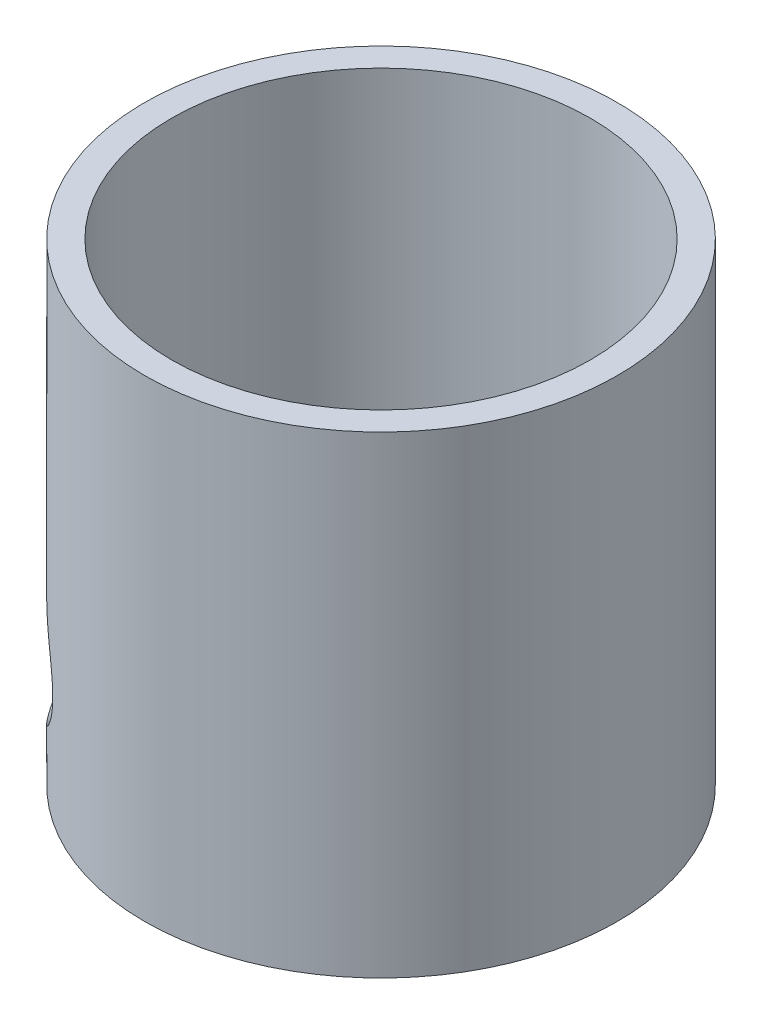
ISO-10303-21;
HEADER;
FILE_DESCRIPTION(('STEP AP214'),'2;1');
FILE_NAME('part.step','',(''),(''),'','','');
FILE_SCHEMA(('AUTOMOTIVE_DESIGN { 1 0 10303 214 1 1 1 1 }'));
ENDSEC;
DATA;
#1=APPLICATION_CONTEXT('core data for automotive mechanical design processes');
#2=APPLICATION_PROTOCOL_DEFINITION('international standard','automotive_design',2000,#1);
#3=PRODUCT_CONTEXT('',#1,'mechanical');
#4=PRODUCT('Part','Part','',(#3));
#5=PRODUCT_RELATED_PRODUCT_CATEGORY('part','',(#4));
#6=PRODUCT_DEFINITION_FORMATION('','',#4);
#7=PRODUCT_DEFINITION_CONTEXT('part definition',#1,'design');
#8=PRODUCT_DEFINITION('design','',#6,#7);
#9=PRODUCT_DEFINITION_SHAPE('','',#8);
#10=(LENGTH_UNIT() NAMED_UNIT(*) SI_UNIT(.MILLI.,.METRE.));
#11=(NAMED_UNIT(*) PLANE_ANGLE_UNIT() SI_UNIT($,.RADIAN.));
#12=(NAMED_UNIT(*) SI_UNIT($,.STERADIAN.) SOLID_ANGLE_UNIT());
#13=UNCERTAINTY_MEASURE_WITH_UNIT(LENGTH_MEASURE(1.E-05),#10,'distance_accuracy_value','');
#14=(GEOMETRIC_REPRESENTATION_CONTEXT(3) GLOBAL_UNCERTAINTY_ASSIGNED_CONTEXT((#13)) GLOBAL_UNIT_ASSIGNED_CONTEXT((#10,
#11,#12)) REPRESENTATION_CONTEXT('',''));
#15=CARTESIAN_POINT('',(0.,0.,0.));
#16=DIRECTION('',(0.,0.,1.));
#17=DIRECTION('',(1.,0.,0.));
#18=AXIS2_PLACEMENT_3D('',#15,#16,#17);
#19=CARTESIAN_POINT('',(0.,175.,0.));
#20=DIRECTION('',(0.,1.,0.));
#21=DIRECTION('',(0.,0.,1.));
#22=AXIS2_PLACEMENT_3D('',#19,#20,#21);
#23=PLANE('',#22);
#24=CARTESIAN_POINT('',(0.,175.,0.));
#25=DIRECTION('',(0.,1.,0.));
#26=DIRECTION('',(0.,0.,1.));
#27=AXIS2_PLACEMENT_3D('',#24,#25,#26);
#28=CIRCLE('',#27,87.5);
#29=CARTESIAN_POINT('',(0.,175.,87.5));
#30=VERTEX_POINT('',#29);
#31=EDGE_CURVE('E60',#30,#30,#28,.T.);
#32=ORIENTED_EDGE('',*,*,#31,.T.);
#33=EDGE_LOOP('',(#32));
#34=FACE_BOUND('',#33,.T.);
#35=CARTESIAN_POINT('',(0.,175.,0.));
#36=DIRECTION('',(0.,1.,0.));
#37=DIRECTION('',(0.,0.,1.));
#38=AXIS2_PLACEMENT_3D('',#35,#36,#37);
#39=CIRCLE('',#38,77.5);
#40=CARTESIAN_POINT('',(0.,175.,77.5));
#41=VERTEX_POINT('',#40);
#42=EDGE_CURVE('E70',#41,#41,#39,.T.);
#43=ORIENTED_EDGE('',*,*,#42,.F.);
#44=EDGE_LOOP('',(#43));
#45=FACE_BOUND('',#44,.T.);
#46=ADVANCED_FACE('F45',(#34,#45),#23,.T.);
#47=CARTESIAN_POINT('',(0.,0.,0.));
#48=DIRECTION('',(0.,1.,0.));
#49=DIRECTION('',(0.,0.,1.));
#50=AXIS2_PLACEMENT_3D('',#47,#48,#49);
#51=PLANE('',#50);
#52=CARTESIAN_POINT('',(0.,0.,0.));
#53=DIRECTION('',(0.,1.,0.));
#54=DIRECTION('',(0.,0.,1.));
#55=AXIS2_PLACEMENT_3D('',#52,#53,#54);
#56=CIRCLE('',#55,87.5);
#57=CARTESIAN_POINT('',(0.,0.,87.5));
#58=VERTEX_POINT('',#57);
#59=EDGE_CURVE('E65',#58,#58,#56,.T.);
#60=ORIENTED_EDGE('',*,*,#59,.F.);
#61=EDGE_LOOP('',(#60));
#62=FACE_BOUND('',#61,.T.);
#63=ADVANCED_FACE('F95',(#62),#51,.F.);
#64=CARTESIAN_POINT('',(0.,175.,0.));
#65=DIRECTION('',(0.,-1.,0.));
#66=DIRECTION('',(0.,0.,-1.));
#67=AXIS2_PLACEMENT_3D('',#64,#65,#66);
#68=CYLINDRICAL_SURFACE('',#67,87.5);
#69=CARTESIAN_POINT('',(-84.5576726264388,40.,22.5));
#70=CARTESIAN_POINT('',(-84.5576709815099,40.6789880306159,22.4999920663012));
#71=CARTESIAN_POINT('',(-84.5503224411179,41.3578644758269,22.5276737519148));
#72=CARTESIAN_POINT('',(-84.5208093244925,42.7110082741885,22.6381585065932));
#73=CARTESIAN_POINT('',(-84.4986413781084,43.3852745436734,22.7209741139047));
#74=CARTESIAN_POINT('',(-84.4391308778603,44.7248112725404,22.9411448149527));
#75=CARTESIAN_POINT('',(-84.4017738620829,45.390072532513,23.0785518838001));
#76=CARTESIAN_POINT('',(-84.3113590414486,46.7061816256562,23.4067015400743));
#77=CARTESIAN_POINT('',(-84.2583021524176,47.3570302971815,23.5974410164083));
#78=CARTESIAN_POINT('',(-84.1358168954945,48.63946722242,24.030498999123));
#79=CARTESIAN_POINT('',(-84.0663948543044,49.2710628130017,24.2727975694509));
#80=CARTESIAN_POINT('',(-83.9103525626,50.5107905072182,24.8068553149492));
#81=CARTESIAN_POINT('',(-83.8237321115854,51.1189223372122,25.0986150667356));
#82=CARTESIAN_POINT('',(-83.6324394391857,52.3072732583138,25.7288441419202));
#83=CARTESIAN_POINT('',(-83.5277726185658,52.8875006341787,26.0672994846181));
#84=CARTESIAN_POINT('',(-83.2994816269074,54.0162519861601,26.7878539153093));
#85=CARTESIAN_POINT('',(-83.1758575273421,54.5647760817947,27.1699528387548));
#86=CARTESIAN_POINT('',(-82.908674750304,55.6270767867045,27.9746583047217));
#87=CARTESIAN_POINT('',(-82.765094204867,56.1408143463339,28.3973091238647));
#88=CARTESIAN_POINT('',(-82.457395275612,57.1296560004361,29.278760176049));
#89=CARTESIAN_POINT('',(-82.2932769567951,57.6047602171742,29.7375602946777));
#90=CARTESIAN_POINT('',(-81.9439779586848,58.5136150228817,30.6869719569538));
#91=CARTESIAN_POINT('',(-81.7587973915611,58.9473658320613,31.1775833311805));
#92=CARTESIAN_POINT('',(-81.3670779728259,59.7713594017159,32.1860401969072));
#93=CARTESIAN_POINT('',(-81.1605388137327,60.1616015356647,32.7038860804268));
#94=CARTESIAN_POINT('',(-80.7216180323965,60.9045439412748,33.772932651533));
#95=CARTESIAN_POINT('',(-80.4887938723668,61.2563119442287,34.324599184372));
#96=CARTESIAN_POINT('',(-80.0011296134841,61.9119017426288,35.446343617857));
#97=CARTESIAN_POINT('',(-79.7462893301589,62.2157231362717,36.0164216727474));
#98=CARTESIAN_POINT('',(-79.2151056590613,62.7751040661585,37.1701543031733));
#99=CARTESIAN_POINT('',(-78.9387592458453,63.0306567946609,37.7538107807709));
#100=CARTESIAN_POINT('',(-78.3654083812156,63.4936949403189,38.9299479114235));
#101=CARTESIAN_POINT('',(-78.0684031688112,63.7011785855741,39.5224288889067));
#102=CARTESIAN_POINT('',(-77.4328451357655,64.0819696140644,40.7543675340566));
#103=CARTESIAN_POINT('',(-77.0928399710657,64.2517765585591,41.3941574118719));
#104=CARTESIAN_POINT('',(-76.3918198433073,64.5385437132106,42.6740244506884));
#105=CARTESIAN_POINT('',(-76.0308040119148,64.655501737461,43.3141016224766));
#106=CARTESIAN_POINT('',(-75.2893332734234,64.8384886559111,44.5904833091532));
#107=CARTESIAN_POINT('',(-74.9088722747533,64.9045014849873,45.2267865712551));
#108=CARTESIAN_POINT('',(-74.1304069731909,64.9877034722907,46.4917679380092));
#109=CARTESIAN_POINT('',(-73.7324018388017,65.0048903138989,47.1204456794486));
#110=CARTESIAN_POINT('',(-72.8632770658031,64.9918727395064,48.4552726447789));
#111=CARTESIAN_POINT('',(-72.3897770353779,64.9546231687916,49.1598058147742));
#112=CARTESIAN_POINT('',(-71.425106386495,64.8229488707532,50.5511730511337));
#113=CARTESIAN_POINT('',(-70.9339342974911,64.7285193749148,51.2380056363781));
#114=CARTESIAN_POINT('',(-69.9365068882376,64.4857454730591,52.5912715462063));
#115=CARTESIAN_POINT('',(-69.4302452678355,64.3373782491898,53.2576961078074));
#116=CARTESIAN_POINT('',(-68.4056116513107,63.9897767760352,54.5675168406587));
#117=CARTESIAN_POINT('',(-67.8872391608069,63.7905404469013,55.2109120690983));
#118=CARTESIAN_POINT('',(-66.7415676432405,63.3013453862096,56.5929724318168));
#119=CARTESIAN_POINT('',(-66.1123102044488,63.0013376945175,57.3264709778406));
#120=CARTESIAN_POINT('',(-64.8452411011117,62.3366497613779,58.7559125096981));
#121=CARTESIAN_POINT('',(-64.2074280695757,61.9719590684794,59.4518494025985));
#122=CARTESIAN_POINT('',(-62.9276074676659,61.1800657783002,60.8048873732454));
#123=CARTESIAN_POINT('',(-62.2855959083085,60.7527915761487,61.4619427392806));
#124=CARTESIAN_POINT('',(-61.0037602592702,59.8375131835746,62.7344125046703));
#125=CARTESIAN_POINT('',(-60.3639358875527,59.3495171520372,63.3498324812446));
#126=CARTESIAN_POINT('',(-59.1507640441547,58.3600010445067,64.4830378033936));
#127=CARTESIAN_POINT('',(-58.5766612444246,57.8637439069901,65.0046128455626));
#128=CARTESIAN_POINT('',(-57.4415245590576,56.819983052243,66.0098159890042));
#129=CARTESIAN_POINT('',(-56.8804929212059,56.2724706009384,66.4934375969814));
#130=CARTESIAN_POINT('',(-55.7803283404082,55.1253424300989,67.4189940681021));
#131=CARTESIAN_POINT('',(-55.2411570897666,54.5258241983268,67.8610038235292));
#132=CARTESIAN_POINT('',(-54.1939012919118,53.2710214877802,68.7002205341296));
#133=CARTESIAN_POINT('',(-53.6857982203455,52.6157708078642,69.0974543084826));
#134=CARTESIAN_POINT('',(-52.9141550141089,51.5275971173745,69.6883963441742));
#135=CARTESIAN_POINT('',(-52.6359305654884,51.1139862765654,69.8986512042679));
#136=CARTESIAN_POINT('',(-52.0986595643484,50.2654593262185,70.300013662257));
#137=CARTESIAN_POINT('',(-51.8396119794592,49.830544365667,70.4911222910689));
#138=CARTESIAN_POINT('',(-51.3452777414288,48.9395092721709,70.8520011117641));
#139=CARTESIAN_POINT('',(-51.1099654855278,48.4834127802056,71.021794345516));
#140=CARTESIAN_POINT('',(-50.667841761014,47.5497057315329,71.3378837662434));
#141=CARTESIAN_POINT('',(-50.4610244428316,47.0720996172098,71.4841847768321));
#142=CARTESIAN_POINT('',(-50.1187964375205,46.1921840193286,71.7244101891019));
#143=CARTESIAN_POINT('',(-49.9773378881898,45.7934957271977,71.822978691757));
#144=CARTESIAN_POINT('',(-49.7195855579474,44.9840622689393,72.0016487383458));
#145=CARTESIAN_POINT('',(-49.6032851712114,44.5733203000142,72.0817551302716));
#146=CARTESIAN_POINT('',(-49.3989170215411,43.7419110923124,72.2219660999938));
#147=CARTESIAN_POINT('',(-49.3108211533308,43.3212541853074,72.2820905916694));
#148=CARTESIAN_POINT('',(-49.1653175338367,42.472154792685,72.3811393920504));
#149=CARTESIAN_POINT('',(-49.1079095209827,42.0437123734601,72.4200638814557));
#150=CARTESIAN_POINT('',(-49.0254204672999,41.1795822162154,72.4759317359206));
#151=CARTESIAN_POINT('',(-49.000541537527,40.7438660572433,72.4927376773061));
#152=CARTESIAN_POINT('',(-48.9846528909233,39.8715395411419,72.5034749387482));
#153=CARTESIAN_POINT('',(-48.9936423952738,39.4349292048054,72.497406784804));
#154=CARTESIAN_POINT('',(-49.0451795184902,38.5644195215133,72.4625511268353));
#155=CARTESIAN_POINT('',(-49.0877428916176,38.1305215436753,72.4337529569339));
#156=CARTESIAN_POINT('',(-49.2049749504316,37.2691440507401,72.354166495221));
#157=CARTESIAN_POINT('',(-49.2796469057087,36.8416651938859,72.3033759639418));
#158=CARTESIAN_POINT('',(-49.4697191301075,35.9442427181743,72.1734833649189));
#159=CARTESIAN_POINT('',(-49.5889882692828,35.4755125691813,72.0916751695754));
#160=CARTESIAN_POINT('',(-49.8608669084497,34.5528578149413,71.9039022109262));
#161=CARTESIAN_POINT('',(-50.0134811932463,34.0989353452514,71.7979339807224));
#162=CARTESIAN_POINT('',(-50.3478172226878,33.2071714537268,71.5638802528098));
#163=CARTESIAN_POINT('',(-50.5295791400648,32.7693532665477,71.4357642105798));
#164=CARTESIAN_POINT('',(-50.9178132948955,31.9112118165525,71.1595602854468));
#165=CARTESIAN_POINT('',(-51.1242943149468,31.4908948437623,71.0114653017209));
#166=CARTESIAN_POINT('',(-51.5052974160656,30.7681101227032,70.7353904540171));
#167=CARTESIAN_POINT('',(-51.6754033015016,30.4618113227372,70.6112596814178));
#168=CARTESIAN_POINT('',(-52.0259437675439,29.8594798558634,70.3533834602058));
#169=CARTESIAN_POINT('',(-52.2063759149843,29.5634447967058,70.2196402746709));
#170=CARTESIAN_POINT('',(-52.7613562359822,28.6900842572298,69.8047437497863));
#171=CARTESIAN_POINT('',(-53.1494682293105,28.1277271557418,69.5100098991164));
#172=CARTESIAN_POINT('',(-53.9533093153606,27.0404956240993,68.8879490615996));
#173=CARTESIAN_POINT('',(-54.3690914424654,26.5156974226007,68.5605588475439));
#174=CARTESIAN_POINT('',(-55.2206582770017,25.5027840892586,67.8765576437728));
#175=CARTESIAN_POINT('',(-55.6564420689698,25.0146672812228,67.5199479908269));
#176=CARTESIAN_POINT('',(-56.4303738096117,24.1926608148439,66.8733810084652));
#177=CARTESIAN_POINT('',(-56.7653226994735,23.8510007225027,66.5893932051827));
#178=CARTESIAN_POINT('',(-57.4415322607397,23.1866900496374,66.0069652670363));
#179=CARTESIAN_POINT('',(-57.782793497243,22.8640411819793,65.7085238343349));
#180=CARTESIAN_POINT('',(-58.4701091276883,22.237307592022,65.0976787376062));
#181=CARTESIAN_POINT('',(-58.8161650164529,21.9332288267022,64.7852706483944));
#182=CARTESIAN_POINT('',(-59.5116077734085,21.3434956768097,64.1470301401532));
#183=CARTESIAN_POINT('',(-59.8609949817775,21.0578431974749,63.8211963386243));
#184=CARTESIAN_POINT('',(-60.9127579223794,20.2279818161357,62.8237141629941));
#185=CARTESIAN_POINT('',(-61.618389315891,19.7111815699673,62.132390771159));
#186=CARTESIAN_POINT('',(-63.0294918189993,18.7516879184927,60.7004457523929));
#187=CARTESIAN_POINT('',(-63.7349629362535,18.3089827564125,59.9598319725534));
#188=CARTESIAN_POINT('',(-65.1506056709139,17.493304663578,58.4188421795941));
#189=CARTESIAN_POINT('',(-65.8606601924785,17.1216145431188,57.617676838764));
#190=CARTESIAN_POINT('',(-67.2667818158244,16.4616780102647,55.9696648166021));
#191=CARTESIAN_POINT('',(-67.9628472052858,16.1734417557279,55.1228125892126));
#192=CARTESIAN_POINT('',(-69.3331098548339,15.6868647680696,53.3890309062119));
#193=CARTESIAN_POINT('',(-70.0073434379527,15.488366751691,52.5021745903445));
#194=CARTESIAN_POINT('',(-71.3285402067826,15.1877530855973,50.6926314574398));
#195=CARTESIAN_POINT('',(-71.9755128887194,15.0856036036117,49.7699573362129));
#196=CARTESIAN_POINT('',(-73.076468218568,14.9981817512581,48.1330732948505));
#197=CARTESIAN_POINT('',(-73.5379272083578,14.9899080937957,47.4250622050545));
#198=CARTESIAN_POINT('',(-74.4392753886547,15.034985866127,45.9973521916666));
#199=CARTESIAN_POINT('',(-74.8791677081968,15.0883283285001,45.2776549838643));
#200=CARTESIAN_POINT('',(-75.7346254007955,15.2598757112387,43.8317458971231));
#201=CARTESIAN_POINT('',(-76.1501974501492,15.3780627374405,43.1055358697855));
#202=CARTESIAN_POINT('',(-76.9546529039036,15.682180698501,41.6523829228477));
#203=CARTESIAN_POINT('',(-77.3435356210794,15.8681133769685,40.9254399848646));
#204=CARTESIAN_POINT('',(-78.0951427501702,16.3116211070491,39.472428781593));
#205=CARTESIAN_POINT('',(-78.4576504125088,16.5697201915023,38.7464074846795));
#206=CARTESIAN_POINT('',(-79.1513841248229,17.1583201529938,37.3087845288485));
#207=CARTESIAN_POINT('',(-79.4826095653993,17.4888224400798,36.597183151053));
#208=CARTESIAN_POINT('',(-80.1122377577065,18.2221731256013,35.1975569624012));
#209=CARTESIAN_POINT('',(-80.4106569164493,18.6249850928195,34.5095204859405));
#210=CARTESIAN_POINT('',(-80.974091018343,19.5017824648628,33.1659044045065));
#211=CARTESIAN_POINT('',(-81.2391109139083,19.9757572948251,32.5103199963423));
#212=CARTESIAN_POINT('',(-81.7045154699855,20.9282506735542,31.3205645711172));
#213=CARTESIAN_POINT('',(-81.9088377072553,21.3987327403627,30.7814821491938));
#214=CARTESIAN_POINT('',(-82.2922812277721,22.389209575895,29.74117923059));
#215=CARTESIAN_POINT('',(-82.4714045922715,22.9092002495957,29.2399556086205));
#216=CARTESIAN_POINT('',(-82.8051320725068,23.9951021124154,28.2810529715114));
#217=CARTESIAN_POINT('',(-82.9597379085343,24.5610100754964,27.8233709021473));
#218=CARTESIAN_POINT('',(-83.2453913252345,25.734504440732,26.9566894888484));
#219=CARTESIAN_POINT('',(-83.3764400919489,26.3420887424543,26.5476876943299));
#220=CARTESIAN_POINT('',(-83.6075534732326,27.5494532433485,25.8101836931604));
#221=CARTESIAN_POINT('',(-83.7091598913002,28.1467084986844,25.4780231891401));
#222=CARTESIAN_POINT('',(-83.89395491179,29.3687268914093,24.8627744634949));
#223=CARTESIAN_POINT('',(-83.9771434755792,29.9934900864956,24.5796863448043));
#224=CARTESIAN_POINT('',(-84.1259315013339,31.265293709982,24.0655208515803));
#225=CARTESIAN_POINT('',(-84.1915501121983,31.9123090112208,23.8343868984347));
#226=CARTESIAN_POINT('',(-84.3061208588966,33.2243147154966,23.4259016895312));
#227=CARTESIAN_POINT('',(-84.3550767910427,33.8893009868314,23.2485381840847));
#228=CARTESIAN_POINT('',(-84.450399997714,35.4517740294409,22.9002857475123));
#229=CARTESIAN_POINT('',(-84.490720891402,36.3543859931001,22.7503557298062));
#230=CARTESIAN_POINT('',(-84.5443583732238,38.1713993647196,22.5502179752016));
#231=CARTESIAN_POINT('',(-84.5576748411945,39.0858008251221,22.5000106820453));
#232=CARTESIAN_POINT('',(-84.5576726264388,40.,22.5));
#233=B_SPLINE_CURVE_WITH_KNOTS('',3,(#69,#70,#71,#72,#73,#74,#75,#76,#77,#78,#79,#80,#81,#82,
#83,#84,#85,#86,#87,#88,#89,#90,#91,#92,#93,#94,#95,#96,#97,#98,#99,#100,#101,#102,#103,#104,
#105,#106,#107,#108,#109,#110,#111,#112,#113,#114,#115,#116,#117,#118,#119,#120,#121,#122,#123,
#124,#125,#126,#127,#128,#129,#130,#131,#132,#133,#134,#135,#136,#137,#138,#139,#140,#141,#142,
#143,#144,#145,#146,#147,#148,#149,#150,#151,#152,#153,#154,#155,#156,#157,#158,#159,#160,#161,
#162,#163,#164,#165,#166,#167,#168,#169,#170,#171,#172,#173,#174,#175,#176,#177,#178,#179,#180,
#181,#182,#183,#184,#185,#186,#187,#188,#189,#190,#191,#192,#193,#194,#195,#196,#197,#198,#199,
#200,#201,#202,#203,#204,#205,#206,#207,#208,#209,#210,#211,#212,#213,#214,#215,#216,#217,#218,
#219,#220,#221,#222,#223,#224,#225,#226,#227,#228,#229,#230,#231,#232),.UNSPECIFIED.,.T.,.F.,(4,
2,2,2,2,2,2,2,2,2,2,2,2,2,2,2,2,2,2,2,2,2,2,2,2,2,2,2,2,2,2,2,2,2,2,2,2,2,2,2,2,2,2,2,2,2,2,2,2,
2,2,2,2,2,2,2,2,2,2,2,2,2,2,2,2,2,2,2,2,2,2,2,2,2,2,2,2,2,2,2,2,4),(0.,2.03616820332662,
4.07279961882964,6.11137472270634,8.14983093314096,10.1875003732643,12.2251935700744,
14.2622779984068,16.2993547466481,18.3386815533137,20.3780019057518,22.4173113980363,
24.4566502526385,26.537744554074,28.6188562946147,30.7002613332837,32.781743083545,
35.0119245130363,37.2421981775544,39.4731748523958,41.7042573773575,44.2508319596315,
46.7976189425232,49.3454845759791,51.8934543988785,54.9262428999402,57.9595218848118,
60.9962989027915,64.0326683241247,66.7929906554782,69.5537842140153,72.3095099476441,
75.063576231412,76.6856930456591,78.3077224710642,79.9279831068999,81.5479106311342,
82.8498753425584,84.1514977786852,85.4518191059324,86.7521293496127,88.0604809350817,
89.3688024346483,90.6777382187749,91.9868073223265,93.4562489240429,94.9259015194232,
96.3975973535353,97.8698176358054,98.9845097820519,100.098940347431,102.328603245053,
104.56267011078,106.796634826472,108.465282088651,110.134079462807,111.8034093775,
113.47291162152,116.813583293843,120.153724393409,123.549440913414,126.945570580483,
130.335724588497,133.724687718471,136.257808701675,138.790561068687,141.322614861994,
143.854733828828,146.405739762795,148.956795381861,151.506569311608,154.055964717078,
156.285389880347,158.514630800307,160.743715234566,162.97268740835,165.042943065115,
167.113203064395,169.181197487488,171.248720436789,173.990234166706,176.731760095676),.UNSPECIFIED.);
#234=CARTESIAN_POINT('',(-84.5576726264388,40.,22.5));
#235=VERTEX_POINT('',#234);
#236=EDGE_CURVE('E75',#235,#235,#233,.T.);
#237=ORIENTED_EDGE('',*,*,#236,.T.);
#238=EDGE_LOOP('',(#237));
#239=FACE_BOUND('',#238,.T.);
#240=ORIENTED_EDGE('',*,*,#31,.F.);
#241=EDGE_LOOP('',(#240));
#242=FACE_BOUND('',#241,.T.);
#243=ORIENTED_EDGE('',*,*,#59,.T.);
#244=EDGE_LOOP('',(#243));
#245=FACE_BOUND('',#244,.T.);
#246=ADVANCED_FACE('F47',(#239,#242,#245),#68,.T.);
#247=CARTESIAN_POINT('',(0.,175.,0.));
#248=DIRECTION('',(0.,-1.,0.));
#249=DIRECTION('',(0.,0.,-1.));
#250=AXIS2_PLACEMENT_3D('',#247,#248,#249);
#251=CYLINDRICAL_SURFACE('',#250,77.5);
#252=CARTESIAN_POINT('',(-74.1619848709566,40.,22.5));
#253=CARTESIAN_POINT('',(-74.1619850506026,40.6726690372966,22.5000011237691));
#254=CARTESIAN_POINT('',(-74.1537580735483,41.3453582654091,22.5271704364877));
#255=CARTESIAN_POINT('',(-74.120728009626,42.6859678626011,22.6356104431371));
#256=CARTESIAN_POINT('',(-74.0959242794548,43.353888045589,22.716883236691));
#257=CARTESIAN_POINT('',(-74.029375924064,44.6803042692999,22.9328203725572));
#258=CARTESIAN_POINT('',(-73.9876284617862,45.3387987126518,23.0674936561597));
#259=CARTESIAN_POINT('',(-73.8866205812493,46.6415472322709,23.3890071803057));
#260=CARTESIAN_POINT('',(-73.8273603542951,47.2858014640117,23.5758468509961));
#261=CARTESIAN_POINT('',(-73.6905813060587,48.5554546909191,23.9999546482754));
#262=CARTESIAN_POINT('',(-73.6130636014788,49.1808548366411,24.2372196905545));
#263=CARTESIAN_POINT('',(-73.4388915285696,50.4084143471844,24.7599485178739));
#264=CARTESIAN_POINT('',(-73.3422371625363,51.0105737147941,25.0454122971311));
#265=CARTESIAN_POINT('',(-73.1288654543652,52.1873646588022,25.6617479291022));
#266=CARTESIAN_POINT('',(-73.0121508448708,52.7619999709631,25.9926135958512));
#267=CARTESIAN_POINT('',(-72.7577149422795,53.879916850522,26.6965335638066));
#268=CARTESIAN_POINT('',(-72.6199936726536,54.423198452951,27.0695878178751));
#269=CARTESIAN_POINT('',(-72.3225129164689,55.4754928572449,27.8546307357468));
#270=CARTESIAN_POINT('',(-72.1627275494653,55.9844643555703,28.2666649403303));
#271=CARTESIAN_POINT('',(-71.8205375946401,56.9643401674662,29.1251407331271));
#272=CARTESIAN_POINT('',(-71.6381331085726,57.4352446522688,29.5715821665531));
#273=CARTESIAN_POINT('',(-71.2502193726886,58.3364252718068,30.4943709616213));
#274=CARTESIAN_POINT('',(-71.0447108845444,58.7667027450376,30.9707173371554));
#275=CARTESIAN_POINT('',(-70.6103553622726,59.5847075681642,31.9486136082496));
#276=CARTESIAN_POINT('',(-70.3815079216533,59.9724341767122,32.450163942707));
#277=CARTESIAN_POINT('',(-69.8945055493822,60.7132050883763,33.4864741377105));
#278=CARTESIAN_POINT('',(-69.6357598530794,61.0651366501679,34.0217512698275));
#279=CARTESIAN_POINT('',(-69.0942011666715,61.7222265402951,35.1085453841402));
#280=CARTESIAN_POINT('',(-68.8113879274591,62.0273843844152,35.660062534387));
#281=CARTESIAN_POINT('',(-68.2223410496431,62.5909785765285,36.7744397599665));
#282=CARTESIAN_POINT('',(-67.9161035315667,62.8494071613886,37.3373017027782));
#283=CARTESIAN_POINT('',(-67.2812074133175,63.3201192828025,38.4696050622364));
#284=CARTESIAN_POINT('',(-66.9525478013957,63.5324007352542,39.0390467748165));
#285=CARTESIAN_POINT('',(-66.2444664844003,63.9284806459276,40.2298544053702));
#286=CARTESIAN_POINT('',(-65.8631157763786,64.1081976473139,40.8514300184969));
#287=CARTESIAN_POINT('',(-65.077028913815,64.4165249479367,42.0923974101879));
#288=CARTESIAN_POINT('',(-64.6722920213244,64.5451336334455,42.7117891191843));
#289=CARTESIAN_POINT('',(-63.8411592026174,64.7537568472115,43.9443869711718));
#290=CARTESIAN_POINT('',(-63.4147567965079,64.8337567433539,44.5575911970496));
#291=CARTESIAN_POINT('',(-62.5421926920855,64.9478520038842,45.7742795659891));
#292=CARTESIAN_POINT('',(-62.096026938821,64.9819379023696,46.3777616793516));
#293=CARTESIAN_POINT('',(-61.3046321141072,65.0037581830867,47.4162442543513));
#294=CARTESIAN_POINT('',(-60.9634207317896,65.0012616090184,47.8541431443433));
#295=CARTESIAN_POINT('',(-60.2721003977663,64.9738904356376,48.721984425601));
#296=CARTESIAN_POINT('',(-59.9219930069961,64.9490197362032,49.1519281901412));
#297=CARTESIAN_POINT('',(-58.8590168019992,64.8425150262313,50.4290814104875));
#298=CARTESIAN_POINT('',(-58.1336318992222,64.7289855389777,51.2634318630142));
#299=CARTESIAN_POINT('',(-56.6538491831119,64.4252193277742,52.8943052354389));
#300=CARTESIAN_POINT('',(-55.8993914889214,64.2348156856161,53.6907415977544));
#301=CARTESIAN_POINT('',(-54.3677930273871,63.7850088253084,55.2411087439144));
#302=CARTESIAN_POINT('',(-53.5906525983312,63.5256066357281,55.995040161182));
#303=CARTESIAN_POINT('',(-52.2867109525912,63.0436005163355,57.2088362174289));
#304=CARTESIAN_POINT('',(-51.7649477035122,62.8386304469275,57.681280626787));
#305=CARTESIAN_POINT('',(-50.7147883496499,62.4031664408708,58.6067398158062));
#306=CARTESIAN_POINT('',(-50.1863918144866,62.1726708404101,59.0597533262441));
#307=CARTESIAN_POINT('',(-49.1240399034022,61.6874468463153,59.9462891764664));
#308=CARTESIAN_POINT('',(-48.5900824273053,61.4327089780654,60.3798037972051));
#309=CARTESIAN_POINT('',(-47.5180279375857,60.9001908181656,61.2270673988399));
#310=CARTESIAN_POINT('',(-46.979931018859,60.622411053328,61.6408168312915));
#311=CARTESIAN_POINT('',(-45.900903441292,60.0446949745343,62.4484679196337));
#312=CARTESIAN_POINT('',(-45.3599732120623,59.7447619341693,62.8423724935879));
#313=CARTESIAN_POINT('',(-44.2764866593008,59.1232552088291,63.6104054977636));
#314=CARTESIAN_POINT('',(-43.733930289606,58.8016809038324,63.9845333608343));
#315=CARTESIAN_POINT('',(-42.6488704813355,58.13729037473,64.7128315348134));
#316=CARTESIAN_POINT('',(-42.1063671280162,57.7944837353396,65.0670107150743));
#317=CARTESIAN_POINT('',(-41.0228421118906,57.0874067723123,65.755520108772));
#318=CARTESIAN_POINT('',(-40.4818203285175,56.7231382530022,66.0898519860652));
#319=CARTESIAN_POINT('',(-39.3297806101837,55.9215278847534,66.7827020877472));
#320=CARTESIAN_POINT('',(-38.7192444234277,55.4809837159024,67.1383306238047));
#321=CARTESIAN_POINT('',(-37.5060381559799,54.5697893748234,67.8235391605744));
#322=CARTESIAN_POINT('',(-36.9033681533591,54.0991389040662,68.1531189029186));
#323=CARTESIAN_POINT('',(-35.7114052362421,53.1254824789808,68.7851689780936));
#324=CARTESIAN_POINT('',(-35.1220955766336,52.6225204460681,69.0876748272244));
#325=CARTESIAN_POINT('',(-34.2529925336438,51.8401894148723,69.5204106518981));
#326=CARTESIAN_POINT('',(-33.9657936864373,51.5747896278797,69.6611403447279));
#327=CARTESIAN_POINT('',(-33.3975332407141,51.0338898565433,69.9353574097799));
#328=CARTESIAN_POINT('',(-33.1164711538535,50.7583906805853,70.0688453595412));
#329=CARTESIAN_POINT('',(-32.5162883547123,50.1501306011793,70.349612837202));
#330=CARTESIAN_POINT('',(-32.19851686145,49.8154078294368,70.4955465080048));
#331=CARTESIAN_POINT('',(-31.5763450938703,49.129396719716,70.7764145553068));
#332=CARTESIAN_POINT('',(-31.2719418812822,48.778112057499,70.9113513544907));
#333=CARTESIAN_POINT('',(-30.6806244718418,48.0570553249656,71.1691875039265));
#334=CARTESIAN_POINT('',(-30.393703236405,47.6872908056165,71.2920917109915));
#335=CARTESIAN_POINT('',(-29.8427857783735,46.9270196240556,71.5244528189521));
#336=CARTESIAN_POINT('',(-29.5787804224368,46.5365213264325,71.6339150845429));
#337=CARTESIAN_POINT('',(-29.1640164720039,45.866545336224,71.8034987356064));
#338=CARTESIAN_POINT('',(-29.0048149414405,45.5933829430505,71.867915128774));
#339=CARTESIAN_POINT('',(-28.7027325904589,45.0364194511149,71.9890935912065));
#340=CARTESIAN_POINT('',(-28.5598532697893,44.7526173779144,72.0458549571838));
#341=CARTESIAN_POINT('',(-28.2939465256949,44.1748305305566,72.1506964883815));
#342=CARTESIAN_POINT('',(-28.1708861851468,43.8808636466341,72.1987910643158));
#343=CARTESIAN_POINT('',(-27.9480229383705,43.282894723335,72.2853535287426));
#344=CARTESIAN_POINT('',(-27.8482097621801,42.978897183251,72.3238256687215));
#345=CARTESIAN_POINT('',(-27.6925770521512,42.4231079604685,72.3835387990074));
#346=CARTESIAN_POINT('',(-27.631962108589,42.1728634705023,72.406682288829));
#347=CARTESIAN_POINT('',(-27.529831496373,41.6680236828279,72.4455752921978));
#348=CARTESIAN_POINT('',(-27.4883064735194,41.4134305795393,72.4613284271502));
#349=CARTESIAN_POINT('',(-27.4256874539279,40.9015332345226,72.4850522483314));
#350=CARTESIAN_POINT('',(-27.4045800510903,40.6442308840328,72.493028041149));
#351=CARTESIAN_POINT('',(-27.3834867159588,40.1286259336185,72.5009985254254));
#352=CARTESIAN_POINT('',(-27.3835010355613,39.8703233218017,72.5009931217009));
#353=CARTESIAN_POINT('',(-27.4046513819686,39.3547291176151,72.4930010803831));
#354=CARTESIAN_POINT('',(-27.4257864364519,39.0974374792512,72.4850148101997));
#355=CARTESIAN_POINT('',(-27.4884355883722,38.5857349949606,72.4612794488975));
#356=CARTESIAN_POINT('',(-27.5299497325436,38.3313241556418,72.4455303399767));
#357=CARTESIAN_POINT('',(-27.6320560202715,37.8267402393385,72.4066464517456));
#358=CARTESIAN_POINT('',(-27.692664299787,37.5765709358953,72.3835054254864));
#359=CARTESIAN_POINT('',(-27.8312296176565,37.0817511664987,72.3303405059316));
#360=CARTESIAN_POINT('',(-27.9091954453799,36.8371035659498,72.300313125349));
#361=CARTESIAN_POINT('',(-28.1231592419552,36.2341133637063,72.2174272738114));
#362=CARTESIAN_POINT('',(-28.2687405049145,35.8796972919079,72.160638935175));
#363=CARTESIAN_POINT('',(-28.5881748357097,35.186087900831,72.0346840746379));
#364=CARTESIAN_POINT('',(-28.7620473178797,34.8469052406124,71.9655090492999));
#365=CARTESIAN_POINT('',(-29.1328927817538,34.182853112564,71.816186277664));
#366=CARTESIAN_POINT('',(-29.3299246684556,33.8580231657271,71.7360104607933));
#367=CARTESIAN_POINT('',(-29.7420685168595,33.2228235695801,71.5661166035391));
#368=CARTESIAN_POINT('',(-29.9571779500722,32.9124519074111,71.4763998971663));
#369=CARTESIAN_POINT('',(-30.4018044780601,32.3050527834095,71.2884180386177));
#370=CARTESIAN_POINT('',(-30.6313193034512,32.0080232322853,71.1901542319911));
#371=CARTESIAN_POINT('',(-31.101923048271,31.4261160702444,70.9858169753533));
#372=CARTESIAN_POINT('',(-31.3430121222661,31.1412386217067,70.8797434210382));
#373=CARTESIAN_POINT('',(-31.8347255866162,30.5823342347763,70.6602631425622));
#374=CARTESIAN_POINT('',(-32.0853578341946,30.3083166337493,70.5468503195367));
#375=CARTESIAN_POINT('',(-32.5942277757485,29.7704228233815,70.313190875114));
#376=CARTESIAN_POINT('',(-32.852466370669,29.5065478239976,70.1929434426006));
#377=CARTESIAN_POINT('',(-33.6377191448897,28.7275797379537,69.8218377911677));
#378=CARTESIAN_POINT('',(-34.174051019363,28.2265041871904,69.5611572516998));
#379=CARTESIAN_POINT('',(-35.2628734998484,27.2568172308963,69.0155850719802));
#380=CARTESIAN_POINT('',(-35.8153592576435,26.7881962242692,68.7307006480292));
#381=CARTESIAN_POINT('',(-36.9082691779074,25.898377933427,68.1498112528252));
#382=CARTESIAN_POINT('',(-37.4482532274108,25.4760224484739,67.8547472357282));
#383=CARTESIAN_POINT('',(-38.5348420719194,24.6555857862389,67.2436214769248));
#384=CARTESIAN_POINT('',(-39.0814478020893,24.2575080867082,66.9275567403876));
#385=CARTESIAN_POINT('',(-40.1789477487439,23.4841232148967,66.2745066722713));
#386=CARTESIAN_POINT('',(-40.7298447016997,23.1088321927208,65.9375068373851));
#387=CARTESIAN_POINT('',(-41.8334140483547,22.380652990891,65.2429349387081));
#388=CARTESIAN_POINT('',(-42.3860863536187,22.0277637129825,64.8853638850704));
#389=CARTESIAN_POINT('',(-43.4912716002042,21.3442951694543,64.1498227537713));
#390=CARTESIAN_POINT('',(-44.0437845229353,21.0137075328682,63.7718604269714));
#391=CARTESIAN_POINT('',(-45.1473438303122,20.3748940765806,62.9954169875006));
#392=CARTESIAN_POINT('',(-45.6983901816679,20.0666687603874,62.596935413165));
#393=CARTESIAN_POINT('',(-46.7973739708518,19.4732699857008,61.7796444320803));
#394=CARTESIAN_POINT('',(-47.3453127164216,19.1880860389297,61.3608444146865));
#395=CARTESIAN_POINT('',(-48.4369690286298,18.6415080154362,60.5028273817094));
#396=CARTESIAN_POINT('',(-48.9806868045764,18.3801127521053,60.0636113861529));
#397=CARTESIAN_POINT('',(-50.3888403958688,17.7321172562631,58.8938445350544));
#398=CARTESIAN_POINT('',(-51.2490787124112,17.3650015795573,58.1472432450397));
#399=CARTESIAN_POINT('',(-52.9502591694854,16.7008215602238,56.6024756434747));
#400=CARTESIAN_POINT('',(-53.7912004993362,16.4037601557835,55.8043071709029));
#401=CARTESIAN_POINT('',(-55.4467994276571,15.8879419391445,54.1595931612342));
#402=CARTESIAN_POINT('',(-56.2614985856051,15.6690551506959,53.3131306636516));
#403=CARTESIAN_POINT('',(-57.8597985439248,15.3182646297796,51.5740923056181));
#404=CARTESIAN_POINT('',(-58.6434086735791,15.1863346146732,50.6815304667052));
#405=CARTESIAN_POINT('',(-59.9876399690152,15.0401181262533,49.0769625451145));
#406=CARTESIAN_POINT('',(-60.5563168698495,15.0050826762876,48.3735601033562));
#407=CARTESIAN_POINT('',(-61.6689025825329,14.9959444696287,46.946929456308));
#408=CARTESIAN_POINT('',(-62.2128132303751,15.0218371886354,46.2237027270377));
#409=CARTESIAN_POINT('',(-63.2721586386305,15.1395143899208,44.7626799657134));
#410=CARTESIAN_POINT('',(-63.7876157693529,15.2312462910028,44.0248960164818));
#411=CARTESIAN_POINT('',(-64.7871743042515,15.4853576549699,42.5402433739236));
#412=CARTESIAN_POINT('',(-65.2712803584222,15.6477266132624,41.7933760474529));
#413=CARTESIAN_POINT('',(-66.1311474865455,16.0157340770838,40.4162412640014));
#414=CARTESIAN_POINT('',(-66.5119414037628,16.2104816830253,39.7861970009014));
#415=CARTESIAN_POINT('',(-67.2473137994175,16.6550494043644,38.530223036893));
#416=CARTESIAN_POINT('',(-67.6018948074182,16.9048641964531,37.9042929442894));
#417=CARTESIAN_POINT('',(-68.2832925710517,17.4608659863034,36.6625619653768));
#418=CARTESIAN_POINT('',(-68.6101151650747,17.7670410867537,36.0467589711302));
#419=CARTESIAN_POINT('',(-69.2349399064074,18.4363140507324,34.8315931002337));
#420=CARTESIAN_POINT('',(-69.5329416205418,18.7994127696029,34.2322304707782));
#421=CARTESIAN_POINT('',(-70.1008039444914,19.5840174991495,33.0538536081398));
#422=CARTESIAN_POINT('',(-70.3705169340117,20.0058055264257,32.4749556480356));
#423=CARTESIAN_POINT('',(-70.8798423838333,20.9048678566914,31.3477361833569));
#424=CARTESIAN_POINT('',(-71.1194543200553,21.3821431254721,30.7994152112404));
#425=CARTESIAN_POINT('',(-71.5687883694102,22.3895049167553,29.7403683874315));
#426=CARTESIAN_POINT('',(-71.7785126961556,22.9195875231598,29.2296397528355));
#427=CARTESIAN_POINT('',(-72.1687632448487,24.0289283007136,28.2523726442167));
#428=CARTESIAN_POINT('',(-72.3492919499687,24.6081822832977,27.7858304134124));
#429=CARTESIAN_POINT('',(-72.6672411857739,25.757219529096,26.9426529276543));
#430=CARTESIAN_POINT('',(-72.8070774194488,26.3231787732265,26.56170602465));
#431=CARTESIAN_POINT('',(-73.0644057937852,27.4880840859191,25.8454536500657));
#432=CARTESIAN_POINT('',(-73.1818991036868,28.0870284262033,25.5101457903847));
#433=CARTESIAN_POINT('',(-73.3955464389393,29.3133071540702,24.8887873149712));
#434=CARTESIAN_POINT('',(-73.4917079712159,29.9406314605152,24.6027193790454));
#435=CARTESIAN_POINT('',(-73.6637764070596,31.2191641167466,24.0826317794145));
#436=CARTESIAN_POINT('',(-73.739684286146,31.8703713144919,23.8486096090099));
#437=CARTESIAN_POINT('',(-73.8662423071221,33.1324173006395,23.4535132148256));
#438=CARTESIAN_POINT('',(-73.9185473259326,33.7416373354072,23.2877784717487));
#439=CARTESIAN_POINT('',(-74.0077525630515,34.9719110577559,23.0027151651772));
#440=CARTESIAN_POINT('',(-74.0446539743786,35.5929638249873,22.8833830078235));
#441=CARTESIAN_POINT('',(-74.1035072863841,36.8430037393133,22.6920743709972));
#442=CARTESIAN_POINT('',(-74.1254595363014,37.4719907007014,22.620096785239));
#443=CARTESIAN_POINT('',(-74.1546986699667,38.7339789938007,22.52405767941));
#444=CARTESIAN_POINT('',(-74.1619847018997,39.3669805565385,22.49999894247));
#445=CARTESIAN_POINT('',(-74.1619848709566,40.,22.5));
#446=B_SPLINE_CURVE_WITH_KNOTS('',3,(#252,#253,#254,#255,#256,#257,#258,#259,#260,#261,#262,
#263,#264,#265,#266,#267,#268,#269,#270,#271,#272,#273,#274,#275,#276,#277,#278,#279,#280,#281,
#282,#283,#284,#285,#286,#287,#288,#289,#290,#291,#292,#293,#294,#295,#296,#297,#298,#299,#300,
#301,#302,#303,#304,#305,#306,#307,#308,#309,#310,#311,#312,#313,#314,#315,#316,#317,#318,#319,
#320,#321,#322,#323,#324,#325,#326,#327,#328,#329,#330,#331,#332,#333,#334,#335,#336,#337,#338,
#339,#340,#341,#342,#343,#344,#345,#346,#347,#348,#349,#350,#351,#352,#353,#354,#355,#356,#357,
#358,#359,#360,#361,#362,#363,#364,#365,#366,#367,#368,#369,#370,#371,#372,#373,#374,#375,#376,
#377,#378,#379,#380,#381,#382,#383,#384,#385,#386,#387,#388,#389,#390,#391,#392,#393,#394,#395,
#396,#397,#398,#399,#400,#401,#402,#403,#404,#405,#406,#407,#408,#409,#410,#411,#412,#413,#414,
#415,#416,#417,#418,#419,#420,#421,#422,#423,#424,#425,#426,#427,#428,#429,#430,#431,#432,#433,
#434,#435,#436,#437,#438,#439,#440,#441,#442,#443,#444,#445),.UNSPECIFIED.,.T.,.F.,(4,2,2,2,2,2,
2,2,2,2,2,2,2,2,2,2,2,2,2,2,2,2,2,2,2,2,2,2,2,2,2,2,2,2,2,2,2,2,2,2,2,2,2,2,2,2,2,2,2,2,2,2,2,2,
2,2,2,2,2,2,2,2,2,2,2,2,2,2,2,2,2,2,2,2,2,2,2,2,2,2,2,2,2,2,2,2,2,2,2,2,2,2,2,2,2,2,4),(0.,
2.01744430585135,4.03496690832206,6.05282746420429,8.07066597832685,10.0883811051787,
12.1060959899324,14.1235362353704,16.1409742267143,18.160799030586,20.1806147484375,
22.2003638983145,24.2201482319419,26.2905524308633,28.3609780617793,30.4317473371781,
32.5026101134803,34.7535327771531,37.0045265072958,39.2561974915521,41.5083326226599,
43.1731915790022,44.8377604015751,48.1675782005938,51.5046653123065,54.841702680464,
57.0403693075698,59.2391793332045,61.4388522778461,63.6384749447062,65.8377732209602,
68.0371345338893,70.2355101453646,72.4337011996803,74.9306890728924,77.4277017096618,
79.9213891523487,81.1680077895929,82.4145268606302,83.8661957032591,85.3175438640486,
86.7683037690023,88.2184827790733,89.1859157280457,90.1534374971733,91.1193353680828,
92.0848057188781,92.8595950279159,93.6340042788374,94.4079047109701,95.181814372593,
95.9556884078877,96.7295642178846,97.5040957725079,98.2790204235886,99.4390993007026,
100.599977644536,101.763875269801,102.927610371889,104.091162600427,105.254730371746,
106.419277791989,107.583963707891,109.919039503747,112.253421532027,114.491680109039,
116.730258563299,118.97040552693,121.210442581501,123.449634100768,125.68887602186,
127.927092844031,130.165197959952,133.752143841666,137.339240138836,140.920344312311,
144.500365601994,147.213649665681,149.926732257296,152.6376505052,155.348165744203,
157.63039285283,159.912399436736,162.19392485448,164.475484558021,166.768412811786,
169.06138098142,171.354179235029,173.646782376826,175.733428255899,177.81996490748,
179.905766111123,181.991466833779,183.890076703653,185.788539497755,187.686957938872,
189.585486637081),.UNSPECIFIED.);
#447=CARTESIAN_POINT('',(-74.1619848709566,40.,22.5));
#448=VERTEX_POINT('',#447);
#449=EDGE_CURVE('E50',#448,#448,#446,.T.);
#450=ORIENTED_EDGE('',*,*,#449,.F.);
#451=EDGE_LOOP('',(#450));
#452=FACE_BOUND('',#451,.T.);
#453=CARTESIAN_POINT('',(0.,5.,0.));
#454=DIRECTION('',(0.,1.,0.));
#455=DIRECTION('',(0.,0.,1.));
#456=AXIS2_PLACEMENT_3D('',#453,#454,#455);
#457=CIRCLE('',#456,77.5);
#458=CARTESIAN_POINT('',(0.,5.,77.5));
#459=VERTEX_POINT('',#458);
#460=EDGE_CURVE('E10',#459,#459,#457,.T.);
#461=ORIENTED_EDGE('',*,*,#460,.F.);
#462=EDGE_LOOP('',(#461));
#463=FACE_BOUND('',#462,.T.);
#464=ORIENTED_EDGE('',*,*,#42,.T.);
#465=EDGE_LOOP('',(#464));
#466=FACE_BOUND('',#465,.T.);
#467=ADVANCED_FACE('F89',(#452,#463,#466),#251,.F.);
#468=CARTESIAN_POINT('',(0.,5.,0.));
#469=DIRECTION('',(0.,1.,0.));
#470=DIRECTION('',(0.,0.,1.));
#471=AXIS2_PLACEMENT_3D('',#468,#469,#470);
#472=PLANE('',#471);
#473=ORIENTED_EDGE('',*,*,#460,.T.);
#474=EDGE_LOOP('',(#473));
#475=FACE_BOUND('',#474,.T.);
#476=ADVANCED_FACE('F85',(#475),#472,.T.);
#477=CARTESIAN_POINT('',(-87.5,40.,47.5));
#478=DIRECTION('',(1.,0.,0.));
#479=DIRECTION('',(0.,0.,-1.));
#480=AXIS2_PLACEMENT_3D('',#477,#478,#479);
#481=CYLINDRICAL_SURFACE('',#480,25.);
#482=ORIENTED_EDGE('',*,*,#449,.T.);
#483=EDGE_LOOP('',(#482));
#484=FACE_BOUND('',#483,.T.);
#485=ORIENTED_EDGE('',*,*,#236,.F.);
#486=EDGE_LOOP('',(#485));
#487=FACE_BOUND('',#486,.T.);
#488=ADVANCED_FACE('F81',(#484,#487),#481,.F.);
#489=CLOSED_SHELL('',(#46,#63,#246,#467,#476,#488));
#490=MANIFOLD_SOLID_BREP('B2',#489);
#491=ADVANCED_BREP_SHAPE_REPRESENTATION('',(#18,#490),#14);
#492=SHAPE_DEFINITION_REPRESENTATION(#9,#491);
ENDSEC;
END-ISO-10303-21;
